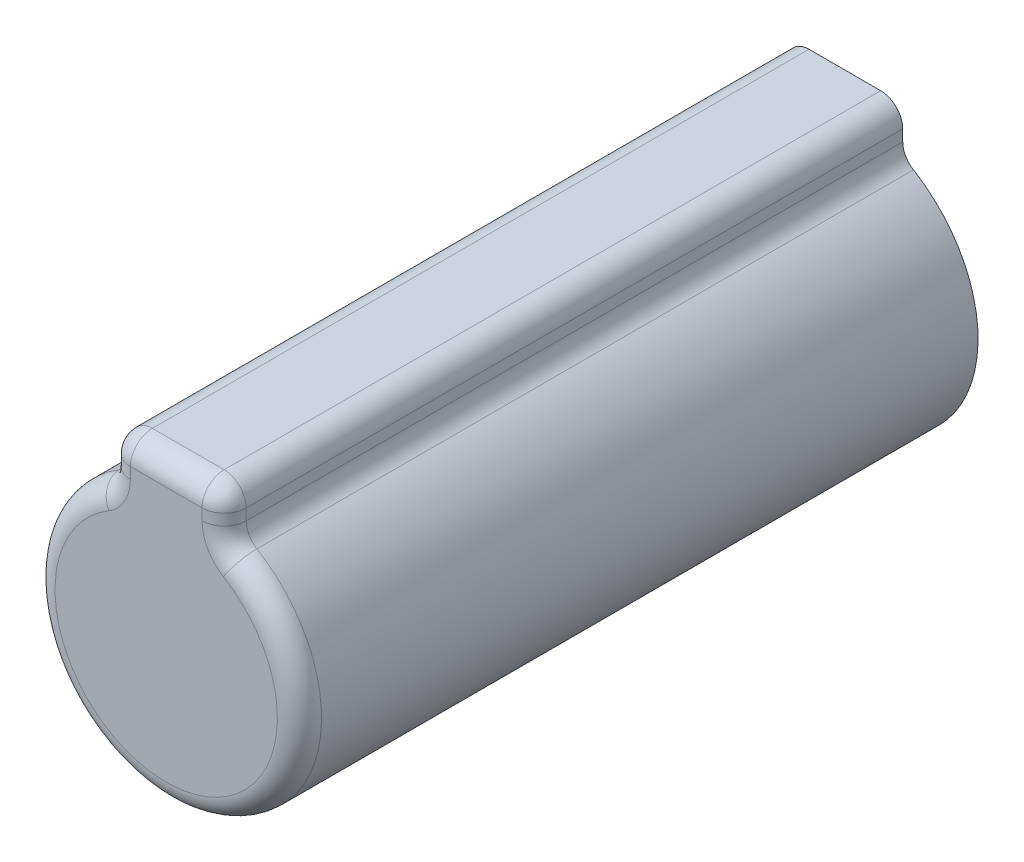
ISO-10303-21;
HEADER;
FILE_DESCRIPTION(('STEP AP214'),'2;1');
FILE_NAME('part.step','',(''),(''),'','','');
FILE_SCHEMA(('AUTOMOTIVE_DESIGN { 1 0 10303 214 1 1 1 1 }'));
ENDSEC;
DATA;
#1=APPLICATION_CONTEXT('core data for automotive mechanical design processes');
#2=APPLICATION_PROTOCOL_DEFINITION('international standard','automotive_design',2000,#1);
#3=PRODUCT_CONTEXT('',#1,'mechanical');
#4=PRODUCT('Part','Part','',(#3));
#5=PRODUCT_RELATED_PRODUCT_CATEGORY('part','',(#4));
#6=PRODUCT_DEFINITION_FORMATION('','',#4);
#7=PRODUCT_DEFINITION_CONTEXT('part definition',#1,'design');
#8=PRODUCT_DEFINITION('design','',#6,#7);
#9=PRODUCT_DEFINITION_SHAPE('','',#8);
#10=(LENGTH_UNIT() NAMED_UNIT(*) SI_UNIT(.MILLI.,.METRE.));
#11=(NAMED_UNIT(*) PLANE_ANGLE_UNIT() SI_UNIT($,.RADIAN.));
#12=(NAMED_UNIT(*) SI_UNIT($,.STERADIAN.) SOLID_ANGLE_UNIT());
#13=UNCERTAINTY_MEASURE_WITH_UNIT(LENGTH_MEASURE(1.E-05),#10,'distance_accuracy_value','');
#14=(GEOMETRIC_REPRESENTATION_CONTEXT(3) GLOBAL_UNCERTAINTY_ASSIGNED_CONTEXT((#13)) GLOBAL_UNIT_ASSIGNED_CONTEXT((#10,
#11,#12)) REPRESENTATION_CONTEXT('',''));
#15=CARTESIAN_POINT('',(0.,0.,0.));
#16=DIRECTION('',(0.,0.,1.));
#17=DIRECTION('',(1.,0.,0.));
#18=AXIS2_PLACEMENT_3D('',#15,#16,#17);
#19=CARTESIAN_POINT('',(0.,0.,0.));
#20=DIRECTION('',(0.,0.,1.));
#21=DIRECTION('',(1.,0.,0.));
#22=AXIS2_PLACEMENT_3D('',#19,#20,#21);
#23=PLANE('',#22);
#24=DIRECTION('',(-1.,0.,0.));
#25=VECTOR('',#24,1.);
#26=CARTESIAN_POINT('',(-7.5,30.15,0.));
#27=LINE('',#26,#25);
#28=CARTESIAN_POINT('',(6.5,30.15,0.));
#29=VERTEX_POINT('',#28);
#30=CARTESIAN_POINT('',(-6.5,30.15,0.));
#31=VERTEX_POINT('',#30);
#32=EDGE_CURVE('E403',#29,#31,#27,.T.);
#33=ORIENTED_EDGE('',*,*,#32,.F.);
#34=CARTESIAN_POINT('',(6.5,26.15,0.));
#35=DIRECTION('',(0.,0.,1.));
#36=DIRECTION('',(1.,0.,0.));
#37=AXIS2_PLACEMENT_3D('',#34,#35,#36);
#38=CIRCLE('',#37,4.);
#39=CARTESIAN_POINT('',(10.5,26.15,0.));
#40=VERTEX_POINT('',#39);
#41=EDGE_CURVE('E417',#29,#40,#38,.F.);
#42=ORIENTED_EDGE('',*,*,#41,.T.);
#43=DIRECTION('',(0.,1.,0.));
#44=VECTOR('',#43,1.);
#45=CARTESIAN_POINT('',(10.5,27.15,0.));
#46=LINE('',#45,#44);
#47=CARTESIAN_POINT('',(10.5,24.1282510762798,0.));
#48=VERTEX_POINT('',#47);
#49=EDGE_CURVE('E399',#48,#40,#46,.T.);
#50=ORIENTED_EDGE('',*,*,#49,.F.);
#51=CARTESIAN_POINT('',(14.5,24.1282510762798,0.));
#52=DIRECTION('',(0.,0.,1.));
#53=DIRECTION('',(1.,0.,0.));
#54=AXIS2_PLACEMENT_3D('',#51,#52,#53);
#55=CIRCLE('',#54,4.);
#56=CARTESIAN_POINT('',(12.4396092362345,20.6997251684603,0.));
#57=VERTEX_POINT('',#56);
#58=EDGE_CURVE('E295',#48,#57,#55,.T.);
#59=ORIENTED_EDGE('',*,*,#58,.T.);
#60=CARTESIAN_POINT('',(0.,0.,0.));
#61=DIRECTION('',(0.,0.,1.));
#62=DIRECTION('',(1.,0.,0.));
#63=AXIS2_PLACEMENT_3D('',#60,#61,#62);
#64=CIRCLE('',#63,24.15);
#65=CARTESIAN_POINT('',(-12.4396092362345,20.6997251684603,0.));
#66=VERTEX_POINT('',#65);
#67=EDGE_CURVE('E395',#66,#57,#64,.T.);
#68=ORIENTED_EDGE('',*,*,#67,.F.);
#69=CARTESIAN_POINT('',(-14.5,24.1282510762798,0.));
#70=DIRECTION('',(0.,0.,1.));
#71=DIRECTION('',(1.,0.,0.));
#72=AXIS2_PLACEMENT_3D('',#69,#70,#71);
#73=CIRCLE('',#72,4.);
#74=CARTESIAN_POINT('',(-10.5,24.1282510762798,0.));
#75=VERTEX_POINT('',#74);
#76=EDGE_CURVE('E292',#66,#75,#73,.T.);
#77=ORIENTED_EDGE('',*,*,#76,.T.);
#78=DIRECTION('',(0.,-1.,0.));
#79=VECTOR('',#78,1.);
#80=CARTESIAN_POINT('',(-10.5,27.15,0.));
#81=LINE('',#80,#79);
#82=CARTESIAN_POINT('',(-10.5,26.15,0.));
#83=VERTEX_POINT('',#82);
#84=EDGE_CURVE('E391',#83,#75,#81,.T.);
#85=ORIENTED_EDGE('',*,*,#84,.F.);
#86=CARTESIAN_POINT('',(-6.5,26.15,0.));
#87=DIRECTION('',(0.,0.,1.));
#88=DIRECTION('',(1.,0.,0.));
#89=AXIS2_PLACEMENT_3D('',#86,#87,#88);
#90=CIRCLE('',#89,4.);
#91=EDGE_CURVE('E414',#83,#31,#90,.F.);
#92=ORIENTED_EDGE('',*,*,#91,.T.);
#93=EDGE_LOOP('',(#33,#42,#50,#59,#68,#77,#85,#92));
#94=FACE_BOUND('',#93,.T.);
#95=DIRECTION('',(0.,-1.,0.));
#96=VECTOR('',#95,1.);
#97=CARTESIAN_POINT('',(-7.5,27.15,0.));
#98=LINE('',#97,#96);
#99=CARTESIAN_POINT('',(-7.5,23.15,0.));
#100=VERTEX_POINT('',#99);
#101=CARTESIAN_POINT('',(-7.5,22.3667722302526,0.));
#102=VERTEX_POINT('',#101);
#103=EDGE_CURVE('E366',#100,#102,#98,.T.);
#104=ORIENTED_EDGE('',*,*,#103,.T.);
#105=CARTESIAN_POINT('',(-11.5,22.3667722302526,0.));
#106=DIRECTION('',(0.,0.,1.));
#107=DIRECTION('',(1.,0.,0.));
#108=AXIS2_PLACEMENT_3D('',#105,#106,#107);
#109=CIRCLE('',#108,4.);
#110=CARTESIAN_POINT('',(-9.67097415506958,18.8094327105305,0.));
#111=VERTEX_POINT('',#110);
#112=EDGE_CURVE('E215',#102,#111,#109,.F.);
#113=ORIENTED_EDGE('',*,*,#112,.T.);
#114=CARTESIAN_POINT('',(0.,0.,0.));
#115=DIRECTION('',(0.,0.,1.));
#116=DIRECTION('',(1.,0.,0.));
#117=AXIS2_PLACEMENT_3D('',#114,#115,#116);
#118=CIRCLE('',#117,21.15);
#119=CARTESIAN_POINT('',(9.67097415506958,18.8094327105305,0.));
#120=VERTEX_POINT('',#119);
#121=EDGE_CURVE('E373',#111,#120,#118,.T.);
#122=ORIENTED_EDGE('',*,*,#121,.T.);
#123=CARTESIAN_POINT('',(11.5,22.3667722302526,0.));
#124=DIRECTION('',(0.,0.,1.));
#125=DIRECTION('',(1.,0.,0.));
#126=AXIS2_PLACEMENT_3D('',#123,#124,#125);
#127=CIRCLE('',#126,4.);
#128=CARTESIAN_POINT('',(7.5,22.3667722302526,0.));
#129=VERTEX_POINT('',#128);
#130=EDGE_CURVE('E209',#120,#129,#127,.F.);
#131=ORIENTED_EDGE('',*,*,#130,.T.);
#132=DIRECTION('',(0.,1.,0.));
#133=VECTOR('',#132,1.);
#134=CARTESIAN_POINT('',(7.5,27.15,0.));
#135=LINE('',#134,#133);
#136=CARTESIAN_POINT('',(7.5,23.15,0.));
#137=VERTEX_POINT('',#136);
#138=EDGE_CURVE('E378',#129,#137,#135,.T.);
#139=ORIENTED_EDGE('',*,*,#138,.T.);
#140=CARTESIAN_POINT('',(3.5,23.15,0.));
#141=DIRECTION('',(0.,0.,1.));
#142=DIRECTION('',(1.,0.,0.));
#143=AXIS2_PLACEMENT_3D('',#140,#141,#142);
#144=CIRCLE('',#143,4.);
#145=CARTESIAN_POINT('',(3.5,27.15,0.));
#146=VERTEX_POINT('',#145);
#147=EDGE_CURVE('E279',#137,#146,#144,.T.);
#148=ORIENTED_EDGE('',*,*,#147,.T.);
#149=DIRECTION('',(-1.,0.,0.));
#150=VECTOR('',#149,1.);
#151=CARTESIAN_POINT('',(-7.5,27.15,0.));
#152=LINE('',#151,#150);
#153=CARTESIAN_POINT('',(-3.5,27.15,0.));
#154=VERTEX_POINT('',#153);
#155=EDGE_CURVE('E387',#146,#154,#152,.T.);
#156=ORIENTED_EDGE('',*,*,#155,.T.);
#157=CARTESIAN_POINT('',(-3.5,23.15,0.));
#158=DIRECTION('',(0.,0.,1.));
#159=DIRECTION('',(1.,0.,0.));
#160=AXIS2_PLACEMENT_3D('',#157,#158,#159);
#161=CIRCLE('',#160,4.);
#162=EDGE_CURVE('E285',#154,#100,#161,.T.);
#163=ORIENTED_EDGE('',*,*,#162,.T.);
#164=EDGE_LOOP('',(#104,#113,#122,#131,#139,#148,#156,#163));
#165=FACE_BOUND('',#164,.T.);
#166=ADVANCED_FACE('F68',(#94,#165),#23,.F.);
#167=CARTESIAN_POINT('',(-10.5,27.15,120.));
#168=DIRECTION('',(1.,0.,0.));
#169=DIRECTION('',(0.,1.,0.));
#170=AXIS2_PLACEMENT_3D('',#167,#168,#169);
#171=PLANE('',#170);
#172=DIRECTION('',(0.,0.,1.));
#173=VECTOR('',#172,1.);
#174=CARTESIAN_POINT('',(-10.5,24.1282510762798,120.));
#175=LINE('',#174,#173);
#176=CARTESIAN_POINT('',(-10.5,24.1282510762798,119.));
#177=VERTEX_POINT('',#176);
#178=EDGE_CURVE('E265',#75,#177,#175,.T.);
#179=ORIENTED_EDGE('',*,*,#178,.T.);
#180=DIRECTION('',(0.,-1.,0.));
#181=VECTOR('',#180,1.);
#182=CARTESIAN_POINT('',(-10.5,26.15,119.));
#183=LINE('',#182,#181);
#184=CARTESIAN_POINT('',(-10.5,26.15,119.));
#185=VERTEX_POINT('',#184);
#186=EDGE_CURVE('E324',#177,#185,#183,.F.);
#187=ORIENTED_EDGE('',*,*,#186,.T.);
#188=DIRECTION('',(0.,0.,-1.));
#189=VECTOR('',#188,1.);
#190=CARTESIAN_POINT('',(-10.5,26.15,120.));
#191=LINE('',#190,#189);
#192=EDGE_CURVE('E269',#185,#83,#191,.T.);
#193=ORIENTED_EDGE('',*,*,#192,.T.);
#194=ORIENTED_EDGE('',*,*,#84,.T.);
#195=EDGE_LOOP('',(#179,#187,#193,#194));
#196=FACE_BOUND('',#195,.T.);
#197=ADVANCED_FACE('F460',(#196),#171,.F.);
#198=CARTESIAN_POINT('',(0.,0.,120.));
#199=DIRECTION('',(0.,0.,-1.));
#200=DIRECTION('',(-1.,0.,0.));
#201=AXIS2_PLACEMENT_3D('',#198,#199,#200);
#202=CYLINDRICAL_SURFACE('',#201,24.15);
#203=DIRECTION('',(0.,0.,-1.));
#204=VECTOR('',#203,1.);
#205=CARTESIAN_POINT('',(12.4396092362345,20.6997251684603,120.));
#206=LINE('',#205,#204);
#207=CARTESIAN_POINT('',(12.4396092362345,20.6997251684603,119.));
#208=VERTEX_POINT('',#207);
#209=EDGE_CURVE('E272',#57,#208,#206,.F.);
#210=ORIENTED_EDGE('',*,*,#209,.T.);
#211=CARTESIAN_POINT('',(0.,0.,119.));
#212=DIRECTION('',(0.,0.,1.));
#213=DIRECTION('',(1.,0.,0.));
#214=AXIS2_PLACEMENT_3D('',#211,#212,#213);
#215=CIRCLE('',#214,24.15);
#216=CARTESIAN_POINT('',(-12.4396092362345,20.6997251684603,119.));
#217=VERTEX_POINT('',#216);
#218=EDGE_CURVE('E317',#208,#217,#215,.F.);
#219=ORIENTED_EDGE('',*,*,#218,.T.);
#220=DIRECTION('',(0.,0.,-1.));
#221=VECTOR('',#220,1.);
#222=CARTESIAN_POINT('',(-12.4396092362345,20.6997251684603,120.));
#223=LINE('',#222,#221);
#224=EDGE_CURVE('E276',#217,#66,#223,.T.);
#225=ORIENTED_EDGE('',*,*,#224,.T.);
#226=ORIENTED_EDGE('',*,*,#67,.T.);
#227=EDGE_LOOP('',(#210,#219,#225,#226));
#228=FACE_BOUND('',#227,.T.);
#229=ADVANCED_FACE('F465',(#228),#202,.T.);
#230=CARTESIAN_POINT('',(10.5,27.15,120.));
#231=DIRECTION('',(-1.,0.,0.));
#232=DIRECTION('',(0.,-1.,0.));
#233=AXIS2_PLACEMENT_3D('',#230,#231,#232);
#234=PLANE('',#233);
#235=DIRECTION('',(0.,0.,-1.));
#236=VECTOR('',#235,1.);
#237=CARTESIAN_POINT('',(10.5,26.15,120.));
#238=LINE('',#237,#236);
#239=CARTESIAN_POINT('',(10.5,26.15,119.));
#240=VERTEX_POINT('',#239);
#241=EDGE_CURVE('E262',#40,#240,#238,.F.);
#242=ORIENTED_EDGE('',*,*,#241,.T.);
#243=DIRECTION('',(0.,1.,0.));
#244=VECTOR('',#243,1.);
#245=CARTESIAN_POINT('',(10.5,24.1282510762798,119.));
#246=LINE('',#245,#244);
#247=CARTESIAN_POINT('',(10.5,24.1282510762798,119.));
#248=VERTEX_POINT('',#247);
#249=EDGE_CURVE('E78',#240,#248,#246,.F.);
#250=ORIENTED_EDGE('',*,*,#249,.T.);
#251=DIRECTION('',(0.,0.,1.));
#252=VECTOR('',#251,1.);
#253=CARTESIAN_POINT('',(10.5,24.1282510762798,0.));
#254=LINE('',#253,#252);
#255=EDGE_CURVE('E259',#248,#48,#254,.F.);
#256=ORIENTED_EDGE('',*,*,#255,.T.);
#257=ORIENTED_EDGE('',*,*,#49,.T.);
#258=EDGE_LOOP('',(#242,#250,#256,#257));
#259=FACE_BOUND('',#258,.T.);
#260=ADVANCED_FACE('F455',(#259),#234,.F.);
#261=CARTESIAN_POINT('',(-7.5,30.15,120.));
#262=DIRECTION('',(0.,-1.,0.));
#263=DIRECTION('',(0.,0.,-1.));
#264=AXIS2_PLACEMENT_3D('',#261,#262,#263);
#265=PLANE('',#264);
#266=DIRECTION('',(0.,0.,-1.));
#267=VECTOR('',#266,1.);
#268=CARTESIAN_POINT('',(-6.5,30.15,120.));
#269=LINE('',#268,#267);
#270=CARTESIAN_POINT('',(-6.5,30.15,119.));
#271=VERTEX_POINT('',#270);
#272=EDGE_CURVE('E252',#31,#271,#269,.F.);
#273=ORIENTED_EDGE('',*,*,#272,.T.);
#274=DIRECTION('',(-1.,0.,0.));
#275=VECTOR('',#274,1.);
#276=CARTESIAN_POINT('',(6.5,30.15,119.));
#277=LINE('',#276,#275);
#278=CARTESIAN_POINT('',(6.5,30.15,119.));
#279=VERTEX_POINT('',#278);
#280=EDGE_CURVE('E330',#271,#279,#277,.F.);
#281=ORIENTED_EDGE('',*,*,#280,.T.);
#282=DIRECTION('',(0.,0.,-1.));
#283=VECTOR('',#282,1.);
#284=CARTESIAN_POINT('',(6.5,30.15,120.));
#285=LINE('',#284,#283);
#286=EDGE_CURVE('E256',#279,#29,#285,.T.);
#287=ORIENTED_EDGE('',*,*,#286,.T.);
#288=ORIENTED_EDGE('',*,*,#32,.T.);
#289=EDGE_LOOP('',(#273,#281,#287,#288));
#290=FACE_BOUND('',#289,.T.);
#291=ADVANCED_FACE('F447',(#290),#265,.F.);
#292=CARTESIAN_POINT('',(-7.5,27.15,120.));
#293=DIRECTION('',(1.,0.,0.));
#294=DIRECTION('',(0.,1.,0.));
#295=AXIS2_PLACEMENT_3D('',#292,#293,#294);
#296=PLANE('',#295);
#297=DIRECTION('',(0.,-1.,0.));
#298=VECTOR('',#297,1.);
#299=CARTESIAN_POINT('',(-7.5,27.15,120.));
#300=LINE('',#299,#298);
#301=CARTESIAN_POINT('',(-7.5,23.15,120.));
#302=VERTEX_POINT('',#301);
#303=CARTESIAN_POINT('',(-7.5,22.3667722302526,120.));
#304=VERTEX_POINT('',#303);
#305=EDGE_CURVE('E226',#302,#304,#300,.T.);
#306=ORIENTED_EDGE('',*,*,#305,.T.);
#307=DIRECTION('',(0.,0.,-1.));
#308=VECTOR('',#307,1.);
#309=CARTESIAN_POINT('',(-7.5,22.3667722302526,120.));
#310=LINE('',#309,#308);
#311=EDGE_CURVE('E410',#304,#102,#310,.T.);
#312=ORIENTED_EDGE('',*,*,#311,.T.);
#313=ORIENTED_EDGE('',*,*,#103,.F.);
#314=DIRECTION('',(0.,0.,-1.));
#315=VECTOR('',#314,1.);
#316=CARTESIAN_POINT('',(-7.5,23.15,120.));
#317=LINE('',#316,#315);
#318=EDGE_CURVE('E407',#100,#302,#317,.F.);
#319=ORIENTED_EDGE('',*,*,#318,.T.);
#320=EDGE_LOOP('',(#306,#312,#313,#319));
#321=FACE_BOUND('',#320,.T.);
#322=ADVANCED_FACE('F445',(#321),#296,.T.);
#323=CARTESIAN_POINT('',(0.,0.,120.));
#324=DIRECTION('',(0.,0.,-1.));
#325=DIRECTION('',(-1.,0.,0.));
#326=AXIS2_PLACEMENT_3D('',#323,#324,#325);
#327=CYLINDRICAL_SURFACE('',#326,21.15);
#328=ORIENTED_EDGE('',*,*,#121,.F.);
#329=DIRECTION('',(0.,0.,-1.));
#330=VECTOR('',#329,1.);
#331=CARTESIAN_POINT('',(-9.67097415506958,18.8094327105305,120.));
#332=LINE('',#331,#330);
#333=CARTESIAN_POINT('',(-9.67097415506958,18.8094327105305,120.));
#334=VERTEX_POINT('',#333);
#335=EDGE_CURVE('E214',#111,#334,#332,.F.);
#336=ORIENTED_EDGE('',*,*,#335,.T.);
#337=CARTESIAN_POINT('',(0.,0.,120.));
#338=DIRECTION('',(0.,0.,1.));
#339=DIRECTION('',(1.,0.,0.));
#340=AXIS2_PLACEMENT_3D('',#337,#338,#339);
#341=CIRCLE('',#340,21.15);
#342=CARTESIAN_POINT('',(9.67097415506958,18.8094327105305,120.));
#343=VERTEX_POINT('',#342);
#344=EDGE_CURVE('E218',#334,#343,#341,.T.);
#345=ORIENTED_EDGE('',*,*,#344,.T.);
#346=DIRECTION('',(0.,0.,-1.));
#347=VECTOR('',#346,1.);
#348=CARTESIAN_POINT('',(9.67097415506958,18.8094327105305,120.));
#349=LINE('',#348,#347);
#350=EDGE_CURVE('E202',#343,#120,#349,.T.);
#351=ORIENTED_EDGE('',*,*,#350,.T.);
#352=EDGE_LOOP('',(#328,#336,#345,#351));
#353=FACE_BOUND('',#352,.T.);
#354=ADVANCED_FACE('F219',(#353),#327,.F.);
#355=CARTESIAN_POINT('',(7.5,27.15,120.));
#356=DIRECTION('',(-1.,0.,0.));
#357=DIRECTION('',(0.,-1.,0.));
#358=AXIS2_PLACEMENT_3D('',#355,#356,#357);
#359=PLANE('',#358);
#360=ORIENTED_EDGE('',*,*,#138,.F.);
#361=DIRECTION('',(0.,0.,-1.));
#362=VECTOR('',#361,1.);
#363=CARTESIAN_POINT('',(7.5,22.3667722302526,120.));
#364=LINE('',#363,#362);
#365=CARTESIAN_POINT('',(7.5,22.3667722302526,120.));
#366=VERTEX_POINT('',#365);
#367=EDGE_CURVE('E242',#129,#366,#364,.F.);
#368=ORIENTED_EDGE('',*,*,#367,.T.);
#369=DIRECTION('',(0.,1.,0.));
#370=VECTOR('',#369,1.);
#371=CARTESIAN_POINT('',(7.5,27.15,120.));
#372=LINE('',#371,#370);
#373=CARTESIAN_POINT('',(7.5,23.15,120.));
#374=VERTEX_POINT('',#373);
#375=EDGE_CURVE('E225',#366,#374,#372,.T.);
#376=ORIENTED_EDGE('',*,*,#375,.T.);
#377=DIRECTION('',(0.,0.,-1.));
#378=VECTOR('',#377,1.);
#379=CARTESIAN_POINT('',(7.5,23.15,0.));
#380=LINE('',#379,#378);
#381=EDGE_CURVE('E235',#374,#137,#380,.T.);
#382=ORIENTED_EDGE('',*,*,#381,.T.);
#383=EDGE_LOOP('',(#360,#368,#376,#382));
#384=FACE_BOUND('',#383,.T.);
#385=ADVANCED_FACE('F453',(#384),#359,.T.);
#386=CARTESIAN_POINT('',(-7.5,27.15,120.));
#387=DIRECTION('',(0.,-1.,0.));
#388=DIRECTION('',(0.,0.,-1.));
#389=AXIS2_PLACEMENT_3D('',#386,#387,#388);
#390=PLANE('',#389);
#391=ORIENTED_EDGE('',*,*,#155,.F.);
#392=DIRECTION('',(0.,0.,-1.));
#393=VECTOR('',#392,1.);
#394=CARTESIAN_POINT('',(3.5,27.15,120.));
#395=LINE('',#394,#393);
#396=CARTESIAN_POINT('',(3.5,27.15,120.));
#397=VERTEX_POINT('',#396);
#398=EDGE_CURVE('E249',#146,#397,#395,.F.);
#399=ORIENTED_EDGE('',*,*,#398,.T.);
#400=DIRECTION('',(-1.,0.,0.));
#401=VECTOR('',#400,1.);
#402=CARTESIAN_POINT('',(-7.5,27.15,120.));
#403=LINE('',#402,#401);
#404=CARTESIAN_POINT('',(-3.5,27.15,120.));
#405=VERTEX_POINT('',#404);
#406=EDGE_CURVE('E381',#397,#405,#403,.T.);
#407=ORIENTED_EDGE('',*,*,#406,.T.);
#408=DIRECTION('',(0.,0.,-1.));
#409=VECTOR('',#408,1.);
#410=CARTESIAN_POINT('',(-3.5,27.15,0.));
#411=LINE('',#410,#409);
#412=EDGE_CURVE('E245',#405,#154,#411,.T.);
#413=ORIENTED_EDGE('',*,*,#412,.T.);
#414=EDGE_LOOP('',(#391,#399,#407,#413));
#415=FACE_BOUND('',#414,.T.);
#416=ADVANCED_FACE('F439',(#415),#390,.T.);
#417=CARTESIAN_POINT('',(-11.5,22.3667722302526,120.));
#418=DIRECTION('',(0.,0.,-1.));
#419=DIRECTION('',(-1.,0.,0.));
#420=AXIS2_PLACEMENT_3D('',#417,#418,#419);
#421=CYLINDRICAL_SURFACE('',#420,4.);
#422=CARTESIAN_POINT('',(-11.5,22.3667722302526,120.));
#423=DIRECTION('',(0.,0.,1.));
#424=DIRECTION('',(1.,0.,0.));
#425=AXIS2_PLACEMENT_3D('',#422,#423,#424);
#426=CIRCLE('',#425,4.);
#427=EDGE_CURVE('E231',#334,#304,#426,.T.);
#428=ORIENTED_EDGE('',*,*,#427,.F.);
#429=ORIENTED_EDGE('',*,*,#335,.F.);
#430=ORIENTED_EDGE('',*,*,#112,.F.);
#431=ORIENTED_EDGE('',*,*,#311,.F.);
#432=EDGE_LOOP('',(#428,#429,#430,#431));
#433=FACE_BOUND('',#432,.T.);
#434=ADVANCED_FACE('F425',(#433),#421,.T.);
#435=CARTESIAN_POINT('',(11.5,22.3667722302526,120.));
#436=DIRECTION('',(0.,0.,-1.));
#437=DIRECTION('',(-1.,0.,0.));
#438=AXIS2_PLACEMENT_3D('',#435,#436,#437);
#439=CYLINDRICAL_SURFACE('',#438,4.);
#440=CARTESIAN_POINT('',(11.5,22.3667722302526,120.));
#441=DIRECTION('',(0.,0.,1.));
#442=DIRECTION('',(1.,0.,0.));
#443=AXIS2_PLACEMENT_3D('',#440,#441,#442);
#444=CIRCLE('',#443,4.);
#445=EDGE_CURVE('E207',#366,#343,#444,.T.);
#446=ORIENTED_EDGE('',*,*,#445,.F.);
#447=ORIENTED_EDGE('',*,*,#367,.F.);
#448=ORIENTED_EDGE('',*,*,#130,.F.);
#449=ORIENTED_EDGE('',*,*,#350,.F.);
#450=EDGE_LOOP('',(#446,#447,#448,#449));
#451=FACE_BOUND('',#450,.T.);
#452=ADVANCED_FACE('F204',(#451),#439,.T.);
#453=CARTESIAN_POINT('',(3.5,23.15,120.));
#454=DIRECTION('',(0.,0.,1.));
#455=DIRECTION('',(1.,0.,0.));
#456=AXIS2_PLACEMENT_3D('',#453,#454,#455);
#457=CYLINDRICAL_SURFACE('',#456,4.);
#458=CARTESIAN_POINT('',(3.5,23.15,120.));
#459=DIRECTION('',(0.,0.,1.));
#460=DIRECTION('',(1.,0.,0.));
#461=AXIS2_PLACEMENT_3D('',#458,#459,#460);
#462=CIRCLE('',#461,4.);
#463=EDGE_CURVE('E282',#397,#374,#462,.F.);
#464=ORIENTED_EDGE('',*,*,#463,.F.);
#465=ORIENTED_EDGE('',*,*,#398,.F.);
#466=ORIENTED_EDGE('',*,*,#147,.F.);
#467=ORIENTED_EDGE('',*,*,#381,.F.);
#468=EDGE_LOOP('',(#464,#465,#466,#467));
#469=FACE_BOUND('',#468,.T.);
#470=ADVANCED_FACE('F479',(#469),#457,.F.);
#471=CARTESIAN_POINT('',(-3.5,23.15,120.));
#472=DIRECTION('',(0.,0.,1.));
#473=DIRECTION('',(1.,0.,0.));
#474=AXIS2_PLACEMENT_3D('',#471,#472,#473);
#475=CYLINDRICAL_SURFACE('',#474,4.);
#476=CARTESIAN_POINT('',(-3.5,23.15,120.));
#477=DIRECTION('',(0.,0.,1.));
#478=DIRECTION('',(1.,0.,0.));
#479=AXIS2_PLACEMENT_3D('',#476,#477,#478);
#480=CIRCLE('',#479,4.);
#481=EDGE_CURVE('E288',#302,#405,#480,.F.);
#482=ORIENTED_EDGE('',*,*,#481,.F.);
#483=ORIENTED_EDGE('',*,*,#318,.F.);
#484=ORIENTED_EDGE('',*,*,#162,.F.);
#485=ORIENTED_EDGE('',*,*,#412,.F.);
#486=EDGE_LOOP('',(#482,#483,#484,#485));
#487=FACE_BOUND('',#486,.T.);
#488=ADVANCED_FACE('F443',(#487),#475,.F.);
#489=CARTESIAN_POINT('',(6.5,26.15,120.));
#490=DIRECTION('',(0.,0.,-1.));
#491=DIRECTION('',(-1.,0.,0.));
#492=AXIS2_PLACEMENT_3D('',#489,#490,#491);
#493=CYLINDRICAL_SURFACE('',#492,4.);
#494=ORIENTED_EDGE('',*,*,#286,.F.);
#495=CARTESIAN_POINT('',(6.5,26.15,119.));
#496=DIRECTION('',(0.,0.,-1.));
#497=DIRECTION('',(-1.,0.,0.));
#498=AXIS2_PLACEMENT_3D('',#495,#496,#497);
#499=CIRCLE('',#498,4.);
#500=EDGE_CURVE('E93',#279,#240,#499,.T.);
#501=ORIENTED_EDGE('',*,*,#500,.T.);
#502=ORIENTED_EDGE('',*,*,#241,.F.);
#503=ORIENTED_EDGE('',*,*,#41,.F.);
#504=EDGE_LOOP('',(#494,#501,#502,#503));
#505=FACE_BOUND('',#504,.T.);
#506=ADVANCED_FACE('F485',(#505),#493,.T.);
#507=CARTESIAN_POINT('',(-6.5,26.15,120.));
#508=DIRECTION('',(0.,0.,-1.));
#509=DIRECTION('',(-1.,0.,0.));
#510=AXIS2_PLACEMENT_3D('',#507,#508,#509);
#511=CYLINDRICAL_SURFACE('',#510,4.);
#512=ORIENTED_EDGE('',*,*,#192,.F.);
#513=CARTESIAN_POINT('',(-6.5,26.15,119.));
#514=DIRECTION('',(0.,0.,-1.));
#515=DIRECTION('',(-1.,0.,0.));
#516=AXIS2_PLACEMENT_3D('',#513,#514,#515);
#517=CIRCLE('',#516,4.);
#518=EDGE_CURVE('E327',#185,#271,#517,.T.);
#519=ORIENTED_EDGE('',*,*,#518,.T.);
#520=ORIENTED_EDGE('',*,*,#272,.F.);
#521=ORIENTED_EDGE('',*,*,#91,.F.);
#522=EDGE_LOOP('',(#512,#519,#520,#521));
#523=FACE_BOUND('',#522,.T.);
#524=ADVANCED_FACE('F488',(#523),#511,.T.);
#525=CARTESIAN_POINT('',(-14.5,24.1282510762798,120.));
#526=DIRECTION('',(0.,0.,-1.));
#527=DIRECTION('',(-1.,0.,0.));
#528=AXIS2_PLACEMENT_3D('',#525,#526,#527);
#529=CYLINDRICAL_SURFACE('',#528,4.);
#530=ORIENTED_EDGE('',*,*,#224,.F.);
#531=CARTESIAN_POINT('',(-14.5,24.1282510762798,119.));
#532=DIRECTION('',(0.,0.,1.));
#533=DIRECTION('',(1.,0.,0.));
#534=AXIS2_PLACEMENT_3D('',#531,#532,#533);
#535=CIRCLE('',#534,4.);
#536=EDGE_CURVE('E321',#217,#177,#535,.T.);
#537=ORIENTED_EDGE('',*,*,#536,.T.);
#538=ORIENTED_EDGE('',*,*,#178,.F.);
#539=ORIENTED_EDGE('',*,*,#76,.F.);
#540=EDGE_LOOP('',(#530,#537,#538,#539));
#541=FACE_BOUND('',#540,.T.);
#542=ADVANCED_FACE('F491',(#541),#529,.F.);
#543=CARTESIAN_POINT('',(14.5,24.1282510762798,120.));
#544=DIRECTION('',(0.,0.,-1.));
#545=DIRECTION('',(-1.,0.,0.));
#546=AXIS2_PLACEMENT_3D('',#543,#544,#545);
#547=CYLINDRICAL_SURFACE('',#546,4.);
#548=ORIENTED_EDGE('',*,*,#255,.F.);
#549=CARTESIAN_POINT('',(14.5,24.1282510762798,119.));
#550=DIRECTION('',(0.,0.,1.));
#551=DIRECTION('',(1.,0.,0.));
#552=AXIS2_PLACEMENT_3D('',#549,#550,#551);
#553=CIRCLE('',#552,4.);
#554=EDGE_CURVE('E12',#248,#208,#553,.T.);
#555=ORIENTED_EDGE('',*,*,#554,.T.);
#556=ORIENTED_EDGE('',*,*,#209,.F.);
#557=ORIENTED_EDGE('',*,*,#58,.F.);
#558=EDGE_LOOP('',(#548,#555,#556,#557));
#559=FACE_BOUND('',#558,.T.);
#560=ADVANCED_FACE('F495',(#559),#547,.F.);
#561=CARTESIAN_POINT('',(14.5,24.1282510762798,120.));
#562=DIRECTION('',(0.,0.,1.));
#563=DIRECTION('',(1.,0.,0.));
#564=AXIS2_PLACEMENT_3D('',#561,#562,#563);
#565=PLANE('',#564);
#566=ORIENTED_EDGE('',*,*,#344,.F.);
#567=ORIENTED_EDGE('',*,*,#427,.T.);
#568=ORIENTED_EDGE('',*,*,#305,.F.);
#569=ORIENTED_EDGE('',*,*,#481,.T.);
#570=ORIENTED_EDGE('',*,*,#406,.F.);
#571=ORIENTED_EDGE('',*,*,#463,.T.);
#572=ORIENTED_EDGE('',*,*,#375,.F.);
#573=ORIENTED_EDGE('',*,*,#445,.T.);
#574=EDGE_LOOP('',(#566,#567,#568,#569,#570,#571,#572,#573));
#575=FACE_BOUND('',#574,.T.);
#576=ADVANCED_FACE('F228',(#575),#565,.F.);
#577=CARTESIAN_POINT('',(14.5,24.1282510762798,123.));
#578=DIRECTION('',(0.,0.,1.));
#579=DIRECTION('',(1.,0.,0.));
#580=AXIS2_PLACEMENT_3D('',#577,#578,#579);
#581=PLANE('',#580);
#582=CARTESIAN_POINT('',(-14.5,24.1282510762798,123.));
#583=DIRECTION('',(0.,0.,1.));
#584=DIRECTION('',(1.,0.,0.));
#585=AXIS2_PLACEMENT_3D('',#582,#583,#584);
#586=CIRCLE('',#585,8.);
#587=CARTESIAN_POINT('',(-6.5,24.1282510762798,123.));
#588=VERTEX_POINT('',#587);
#589=CARTESIAN_POINT('',(-10.3792184724689,17.2711992606408,123.));
#590=VERTEX_POINT('',#589);
#591=EDGE_CURVE('E310',#588,#590,#586,.F.);
#592=ORIENTED_EDGE('',*,*,#591,.T.);
#593=CARTESIAN_POINT('',(0.,0.,123.));
#594=DIRECTION('',(0.,0.,1.));
#595=DIRECTION('',(1.,0.,0.));
#596=AXIS2_PLACEMENT_3D('',#593,#594,#595);
#597=CIRCLE('',#596,20.15);
#598=CARTESIAN_POINT('',(10.3792184724689,17.2711992606408,123.));
#599=VERTEX_POINT('',#598);
#600=EDGE_CURVE('E313',#590,#599,#597,.T.);
#601=ORIENTED_EDGE('',*,*,#600,.T.);
#602=CARTESIAN_POINT('',(14.5,24.1282510762798,123.));
#603=DIRECTION('',(0.,0.,1.));
#604=DIRECTION('',(1.,0.,0.));
#605=AXIS2_PLACEMENT_3D('',#602,#603,#604);
#606=CIRCLE('',#605,8.);
#607=CARTESIAN_POINT('',(6.5,24.1282510762798,123.));
#608=VERTEX_POINT('',#607);
#609=EDGE_CURVE('E298',#599,#608,#606,.F.);
#610=ORIENTED_EDGE('',*,*,#609,.T.);
#611=DIRECTION('',(0.,1.,0.));
#612=VECTOR('',#611,1.);
#613=CARTESIAN_POINT('',(6.5,26.15,123.));
#614=LINE('',#613,#612);
#615=CARTESIAN_POINT('',(6.5,26.15,123.));
#616=VERTEX_POINT('',#615);
#617=EDGE_CURVE('E301',#608,#616,#614,.T.);
#618=ORIENTED_EDGE('',*,*,#617,.T.);
#619=DIRECTION('',(-1.,0.,0.));
#620=VECTOR('',#619,1.);
#621=CARTESIAN_POINT('',(-6.5,26.15,123.));
#622=LINE('',#621,#620);
#623=CARTESIAN_POINT('',(-6.5,26.15,123.));
#624=VERTEX_POINT('',#623);
#625=EDGE_CURVE('E304',#616,#624,#622,.T.);
#626=ORIENTED_EDGE('',*,*,#625,.T.);
#627=DIRECTION('',(0.,-1.,0.));
#628=VECTOR('',#627,1.);
#629=CARTESIAN_POINT('',(-6.5,24.1282510762798,123.));
#630=LINE('',#629,#628);
#631=EDGE_CURVE('E307',#624,#588,#630,.T.);
#632=ORIENTED_EDGE('',*,*,#631,.T.);
#633=EDGE_LOOP('',(#592,#601,#610,#618,#626,#632));
#634=FACE_BOUND('',#633,.T.);
#635=ADVANCED_FACE('F527',(#634),#581,.T.);
#636=CARTESIAN_POINT('',(14.5,26.15,119.));
#637=DIRECTION('',(1.,0.,0.));
#638=DIRECTION('',(0.,0.,-1.));
#639=AXIS2_PLACEMENT_3D('',#636,#637,#638);
#640=CYLINDRICAL_SURFACE('',#639,4.);
#641=CARTESIAN_POINT('',(6.5,26.15,119.));
#642=DIRECTION('',(1.,0.,0.));
#643=DIRECTION('',(0.,0.,-1.));
#644=AXIS2_PLACEMENT_3D('',#641,#642,#643);
#645=CIRCLE('',#644,4.);
#646=EDGE_CURVE('E358',#279,#616,#645,.T.);
#647=ORIENTED_EDGE('',*,*,#646,.F.);
#648=ORIENTED_EDGE('',*,*,#280,.F.);
#649=CARTESIAN_POINT('',(-6.5,26.15,119.));
#650=DIRECTION('',(-1.,0.,0.));
#651=DIRECTION('',(0.,0.,1.));
#652=AXIS2_PLACEMENT_3D('',#649,#650,#651);
#653=CIRCLE('',#652,4.);
#654=EDGE_CURVE('E72',#624,#271,#653,.T.);
#655=ORIENTED_EDGE('',*,*,#654,.F.);
#656=ORIENTED_EDGE('',*,*,#625,.F.);
#657=EDGE_LOOP('',(#647,#648,#655,#656));
#658=FACE_BOUND('',#657,.T.);
#659=ADVANCED_FACE('F70',(#658),#640,.T.);
#660=CARTESIAN_POINT('',(-6.5,26.15,119.));
#661=DIRECTION('',(0.,0.,1.));
#662=DIRECTION('',(1.,0.,0.));
#663=AXIS2_PLACEMENT_3D('',#660,#661,#662);
#664=SPHERICAL_SURFACE('',#663,4.);
#665=ORIENTED_EDGE('',*,*,#654,.T.);
#666=ORIENTED_EDGE('',*,*,#518,.F.);
#667=CARTESIAN_POINT('',(-6.5,26.15,119.));
#668=DIRECTION('',(0.,-1.,0.));
#669=DIRECTION('',(0.,0.,-1.));
#670=AXIS2_PLACEMENT_3D('',#667,#668,#669);
#671=CIRCLE('',#670,4.);
#672=EDGE_CURVE('E355',#624,#185,#671,.T.);
#673=ORIENTED_EDGE('',*,*,#672,.F.);
#674=EDGE_LOOP('',(#665,#666,#673));
#675=FACE_BOUND('',#674,.T.);
#676=ADVANCED_FACE('F522',(#675),#664,.T.);
#677=CARTESIAN_POINT('',(6.5,26.15,119.));
#678=DIRECTION('',(0.,0.,1.));
#679=DIRECTION('',(1.,0.,0.));
#680=AXIS2_PLACEMENT_3D('',#677,#678,#679);
#681=SPHERICAL_SURFACE('',#680,4.);
#682=ORIENTED_EDGE('',*,*,#500,.F.);
#683=ORIENTED_EDGE('',*,*,#646,.T.);
#684=CARTESIAN_POINT('',(6.5,26.15,119.));
#685=DIRECTION('',(0.,-1.,0.));
#686=DIRECTION('',(0.,0.,-1.));
#687=AXIS2_PLACEMENT_3D('',#684,#685,#686);
#688=CIRCLE('',#687,4.);
#689=EDGE_CURVE('E351',#240,#616,#688,.T.);
#690=ORIENTED_EDGE('',*,*,#689,.F.);
#691=EDGE_LOOP('',(#682,#683,#690));
#692=FACE_BOUND('',#691,.T.);
#693=ADVANCED_FACE('F519',(#692),#681,.T.);
#694=CARTESIAN_POINT('',(-6.5,24.1282510762798,119.));
#695=DIRECTION('',(0.,1.,0.));
#696=DIRECTION('',(-1.,0.,0.));
#697=AXIS2_PLACEMENT_3D('',#694,#695,#696);
#698=CYLINDRICAL_SURFACE('',#697,4.);
#699=ORIENTED_EDGE('',*,*,#672,.T.);
#700=ORIENTED_EDGE('',*,*,#186,.F.);
#701=CARTESIAN_POINT('',(-6.5,24.1282510762798,119.));
#702=DIRECTION('',(0.,-1.,0.));
#703=DIRECTION('',(0.,0.,-1.));
#704=AXIS2_PLACEMENT_3D('',#701,#702,#703);
#705=CIRCLE('',#704,4.);
#706=EDGE_CURVE('E347',#588,#177,#705,.T.);
#707=ORIENTED_EDGE('',*,*,#706,.F.);
#708=ORIENTED_EDGE('',*,*,#631,.F.);
#709=EDGE_LOOP('',(#699,#700,#707,#708));
#710=FACE_BOUND('',#709,.T.);
#711=ADVANCED_FACE('F515',(#710),#698,.T.);
#712=CARTESIAN_POINT('',(6.5,24.1282510762798,119.));
#713=DIRECTION('',(0.,-1.,0.));
#714=DIRECTION('',(1.,0.,0.));
#715=AXIS2_PLACEMENT_3D('',#712,#713,#714);
#716=CYLINDRICAL_SURFACE('',#715,4.);
#717=ORIENTED_EDGE('',*,*,#689,.T.);
#718=ORIENTED_EDGE('',*,*,#617,.F.);
#719=CARTESIAN_POINT('',(6.5,24.1282510762798,119.));
#720=DIRECTION('',(0.,-1.,0.));
#721=DIRECTION('',(0.,0.,-1.));
#722=AXIS2_PLACEMENT_3D('',#719,#720,#721);
#723=CIRCLE('',#722,4.);
#724=EDGE_CURVE('E343',#248,#608,#723,.T.);
#725=ORIENTED_EDGE('',*,*,#724,.F.);
#726=ORIENTED_EDGE('',*,*,#249,.F.);
#727=EDGE_LOOP('',(#717,#718,#725,#726));
#728=FACE_BOUND('',#727,.T.);
#729=ADVANCED_FACE('F511',(#728),#716,.T.);
#730=CARTESIAN_POINT('',(-14.5,24.1282510762798,119.));
#731=DIRECTION('',(0.,0.,1.));
#732=DIRECTION('',(1.,0.,0.));
#733=AXIS2_PLACEMENT_3D('',#730,#731,#732);
#734=TOROIDAL_SURFACE('',#733,8.,4.);
#735=ORIENTED_EDGE('',*,*,#706,.T.);
#736=ORIENTED_EDGE('',*,*,#536,.F.);
#737=CARTESIAN_POINT('',(-10.3792184724689,17.2711992606408,119.));
#738=DIRECTION('',(-0.857131476954879,-0.515097690941386,0.));
#739=DIRECTION('',(0.515097690941386,-0.857131476954879,0.));
#740=AXIS2_PLACEMENT_3D('',#737,#738,#739);
#741=CIRCLE('',#740,4.);
#742=EDGE_CURVE('E340',#590,#217,#741,.T.);
#743=ORIENTED_EDGE('',*,*,#742,.F.);
#744=ORIENTED_EDGE('',*,*,#591,.F.);
#745=EDGE_LOOP('',(#735,#736,#743,#744));
#746=FACE_BOUND('',#745,.T.);
#747=ADVANCED_FACE('F507',(#746),#734,.T.);
#748=CARTESIAN_POINT('',(14.5,24.1282510762798,119.));
#749=DIRECTION('',(0.,0.,1.));
#750=DIRECTION('',(1.,0.,0.));
#751=AXIS2_PLACEMENT_3D('',#748,#749,#750);
#752=TOROIDAL_SURFACE('',#751,8.,4.);
#753=ORIENTED_EDGE('',*,*,#724,.T.);
#754=ORIENTED_EDGE('',*,*,#609,.F.);
#755=CARTESIAN_POINT('',(10.3792184724689,17.2711992606408,119.));
#756=DIRECTION('',(0.857131476954879,-0.515097690941386,0.));
#757=DIRECTION('',(0.515097690941386,0.857131476954879,0.));
#758=AXIS2_PLACEMENT_3D('',#755,#756,#757);
#759=CIRCLE('',#758,4.);
#760=EDGE_CURVE('E337',#208,#599,#759,.T.);
#761=ORIENTED_EDGE('',*,*,#760,.F.);
#762=ORIENTED_EDGE('',*,*,#554,.F.);
#763=EDGE_LOOP('',(#753,#754,#761,#762));
#764=FACE_BOUND('',#763,.T.);
#765=ADVANCED_FACE('F503',(#764),#752,.T.);
#766=CARTESIAN_POINT('',(0.,0.,119.));
#767=DIRECTION('',(0.,0.,1.));
#768=DIRECTION('',(1.,0.,0.));
#769=AXIS2_PLACEMENT_3D('',#766,#767,#768);
#770=TOROIDAL_SURFACE('',#769,20.15,4.);
#771=ORIENTED_EDGE('',*,*,#742,.T.);
#772=ORIENTED_EDGE('',*,*,#218,.F.);
#773=ORIENTED_EDGE('',*,*,#760,.T.);
#774=ORIENTED_EDGE('',*,*,#600,.F.);
#775=EDGE_LOOP('',(#771,#772,#773,#774));
#776=FACE_BOUND('',#775,.T.);
#777=ADVANCED_FACE('F500',(#776),#770,.T.);
#778=CLOSED_SHELL('',(#166,#197,#229,#260,#291,#322,#354,#385,#416,#434,#452,#470,#488,#506,
#524,#542,#560,#576,#635,#659,#676,#693,#711,#729,#747,#765,#777));
#779=MANIFOLD_SOLID_BREP('B2',#778);
#780=ADVANCED_BREP_SHAPE_REPRESENTATION('',(#18,#779),#14);
#781=SHAPE_DEFINITION_REPRESENTATION(#9,#780);
ENDSEC;
END-ISO-10303-21;
